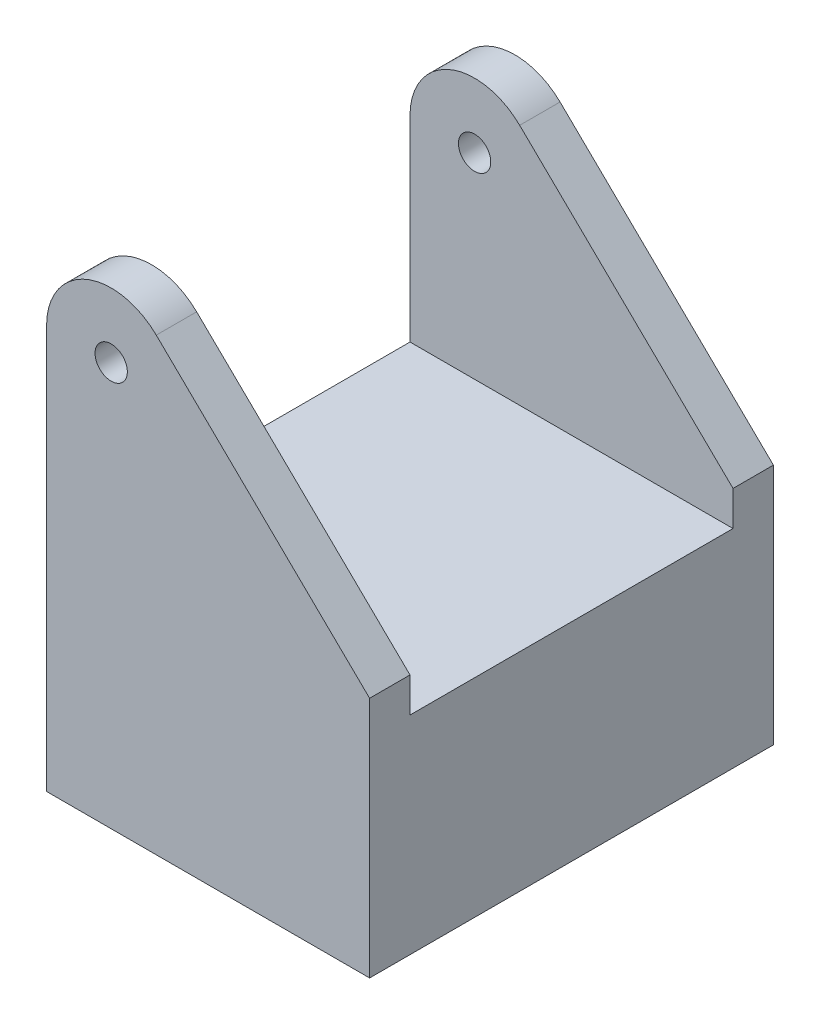
ISO-10303-21;
HEADER;
FILE_DESCRIPTION(('STEP AP214'),'2;1');
FILE_NAME('part.step','',(''),(''),'','','');
FILE_SCHEMA(('AUTOMOTIVE_DESIGN { 1 0 10303 214 1 1 1 1 }'));
ENDSEC;
DATA;
#1=APPLICATION_CONTEXT('core data for automotive mechanical design processes');
#2=APPLICATION_PROTOCOL_DEFINITION('international standard','automotive_design',2000,#1);
#3=PRODUCT_CONTEXT('',#1,'mechanical');
#4=PRODUCT('Part','Part','',(#3));
#5=PRODUCT_RELATED_PRODUCT_CATEGORY('part','',(#4));
#6=PRODUCT_DEFINITION_FORMATION('','',#4);
#7=PRODUCT_DEFINITION_CONTEXT('part definition',#1,'design');
#8=PRODUCT_DEFINITION('design','',#6,#7);
#9=PRODUCT_DEFINITION_SHAPE('','',#8);
#10=(LENGTH_UNIT() NAMED_UNIT(*) SI_UNIT(.MILLI.,.METRE.));
#11=(NAMED_UNIT(*) PLANE_ANGLE_UNIT() SI_UNIT($,.RADIAN.));
#12=(NAMED_UNIT(*) SI_UNIT($,.STERADIAN.) SOLID_ANGLE_UNIT());
#13=UNCERTAINTY_MEASURE_WITH_UNIT(LENGTH_MEASURE(1.E-05),#10,'distance_accuracy_value','');
#14=(GEOMETRIC_REPRESENTATION_CONTEXT(3) GLOBAL_UNCERTAINTY_ASSIGNED_CONTEXT((#13)) GLOBAL_UNIT_ASSIGNED_CONTEXT((#10,
#11,#12)) REPRESENTATION_CONTEXT('',''));
#15=CARTESIAN_POINT('',(0.,0.,0.));
#16=DIRECTION('',(0.,0.,1.));
#17=DIRECTION('',(1.,0.,0.));
#18=AXIS2_PLACEMENT_3D('',#15,#16,#17);
#19=CARTESIAN_POINT('',(200.,150.,250.));
#20=DIRECTION('',(-0.697727216701848,-0.716363546722956,0.));
#21=DIRECTION('',(0.716363546722956,-0.697727216701848,0.));
#22=AXIS2_PLACEMENT_3D('',#19,#20,#21);
#23=PLANE('',#22);
#24=DIRECTION('',(0.,0.,-1.));
#25=VECTOR('',#24,1.);
#26=CARTESIAN_POINT('',(67.9090886680739,278.654541868918,250.));
#27=LINE('',#26,#25);
#28=CARTESIAN_POINT('',(67.9090886680739,278.654541868918,25.));
#29=VERTEX_POINT('',#28);
#30=CARTESIAN_POINT('',(67.9090886680739,278.654541868918,0.));
#31=VERTEX_POINT('',#30);
#32=EDGE_CURVE('E143',#29,#31,#27,.T.);
#33=ORIENTED_EDGE('',*,*,#32,.F.);
#34=DIRECTION('',(0.716363546722956,-0.697727216701848,0.));
#35=VECTOR('',#34,1.);
#36=CARTESIAN_POINT('',(200.,150.,25.));
#37=LINE('',#36,#35);
#38=CARTESIAN_POINT('',(200.,150.,25.));
#39=VERTEX_POINT('',#38);
#40=EDGE_CURVE('E172',#29,#39,#37,.T.);
#41=ORIENTED_EDGE('',*,*,#40,.T.);
#42=DIRECTION('',(0.,0.,-1.));
#43=VECTOR('',#42,1.);
#44=CARTESIAN_POINT('',(200.,150.,250.));
#45=LINE('',#44,#43);
#46=CARTESIAN_POINT('',(200.,150.,0.));
#47=VERTEX_POINT('',#46);
#48=EDGE_CURVE('E117',#39,#47,#45,.T.);
#49=ORIENTED_EDGE('',*,*,#48,.T.);
#50=DIRECTION('',(-0.716363546722956,0.697727216701848,0.));
#51=VECTOR('',#50,1.);
#52=CARTESIAN_POINT('',(200.,150.,0.));
#53=LINE('',#52,#51);
#54=EDGE_CURVE('E134',#47,#31,#53,.T.);
#55=ORIENTED_EDGE('',*,*,#54,.T.);
#56=EDGE_LOOP('',(#33,#41,#49,#55));
#57=FACE_BOUND('',#56,.T.);
#58=ADVANCED_FACE('F32',(#57),#23,.F.);
#59=CARTESIAN_POINT('',(40.,250.,250.));
#60=DIRECTION('',(0.,0.,-1.));
#61=DIRECTION('',(-1.,0.,0.));
#62=AXIS2_PLACEMENT_3D('',#59,#60,#61);
#63=CYLINDRICAL_SURFACE('',#62,40.);
#64=CARTESIAN_POINT('',(40.,250.,25.));
#65=DIRECTION('',(0.,0.,-1.));
#66=DIRECTION('',(0.,1.,0.));
#67=AXIS2_PLACEMENT_3D('',#64,#65,#66);
#68=CIRCLE('',#67,40.);
#69=CARTESIAN_POINT('',(0.,250.,25.));
#70=VERTEX_POINT('',#69);
#71=EDGE_CURVE('E169',#70,#29,#68,.T.);
#72=ORIENTED_EDGE('',*,*,#71,.T.);
#73=ORIENTED_EDGE('',*,*,#32,.T.);
#74=CARTESIAN_POINT('',(40.,250.,0.));
#75=DIRECTION('',(0.,0.,1.));
#76=DIRECTION('',(1.,0.,0.));
#77=AXIS2_PLACEMENT_3D('',#74,#75,#76);
#78=CIRCLE('',#77,40.);
#79=CARTESIAN_POINT('',(0.,250.,0.));
#80=VERTEX_POINT('',#79);
#81=EDGE_CURVE('E137',#31,#80,#78,.T.);
#82=ORIENTED_EDGE('',*,*,#81,.T.);
#83=DIRECTION('',(0.,0.,-1.));
#84=VECTOR('',#83,1.);
#85=CARTESIAN_POINT('',(0.,250.,250.));
#86=LINE('',#85,#84);
#87=EDGE_CURVE('E81',#70,#80,#86,.T.);
#88=ORIENTED_EDGE('',*,*,#87,.F.);
#89=EDGE_LOOP('',(#72,#73,#82,#88));
#90=FACE_BOUND('',#89,.T.);
#91=ADVANCED_FACE('F225',(#90),#63,.T.);
#92=CARTESIAN_POINT('',(40.,250.,250.));
#93=DIRECTION('',(0.,0.,-1.));
#94=DIRECTION('',(-1.,0.,0.));
#95=AXIS2_PLACEMENT_3D('',#92,#93,#94);
#96=CYLINDRICAL_SURFACE('',#95,10.);
#97=CARTESIAN_POINT('',(40.,250.,25.));
#98=DIRECTION('',(0.,0.,-1.));
#99=DIRECTION('',(0.,1.,0.));
#100=AXIS2_PLACEMENT_3D('',#97,#98,#99);
#101=CIRCLE('',#100,10.);
#102=CARTESIAN_POINT('',(40.,260.,25.));
#103=VERTEX_POINT('',#102);
#104=EDGE_CURVE('E36',#103,#103,#101,.T.);
#105=ORIENTED_EDGE('',*,*,#104,.F.);
#106=EDGE_LOOP('',(#105));
#107=FACE_BOUND('',#106,.T.);
#108=CARTESIAN_POINT('',(40.,250.,0.));
#109=DIRECTION('',(0.,0.,1.));
#110=DIRECTION('',(1.,0.,0.));
#111=AXIS2_PLACEMENT_3D('',#108,#109,#110);
#112=CIRCLE('',#111,10.);
#113=CARTESIAN_POINT('',(50.,250.,0.));
#114=VERTEX_POINT('',#113);
#115=EDGE_CURVE('E180',#114,#114,#112,.T.);
#116=ORIENTED_EDGE('',*,*,#115,.F.);
#117=EDGE_LOOP('',(#116));
#118=FACE_BOUND('',#117,.T.);
#119=ADVANCED_FACE('F227',(#107,#118),#96,.F.);
#120=CARTESIAN_POINT('',(40.,250.,250.));
#121=DIRECTION('',(0.,0.,1.));
#122=DIRECTION('',(1.,0.,0.));
#123=AXIS2_PLACEMENT_3D('',#120,#121,#122);
#124=PLANE('',#123);
#125=DIRECTION('',(0.,-1.,0.));
#126=VECTOR('',#125,1.);
#127=CARTESIAN_POINT('',(0.,0.,250.));
#128=LINE('',#127,#126);
#129=CARTESIAN_POINT('',(0.,250.,250.));
#130=VERTEX_POINT('',#129);
#131=CARTESIAN_POINT('',(0.,0.,250.));
#132=VERTEX_POINT('',#131);
#133=EDGE_CURVE('E58',#130,#132,#128,.T.);
#134=ORIENTED_EDGE('',*,*,#133,.T.);
#135=DIRECTION('',(1.,0.,0.));
#136=VECTOR('',#135,1.);
#137=CARTESIAN_POINT('',(0.,0.,250.));
#138=LINE('',#137,#136);
#139=CARTESIAN_POINT('',(200.,0.,250.));
#140=VERTEX_POINT('',#139);
#141=EDGE_CURVE('E89',#132,#140,#138,.T.);
#142=ORIENTED_EDGE('',*,*,#141,.T.);
#143=DIRECTION('',(0.,1.,0.));
#144=VECTOR('',#143,1.);
#145=CARTESIAN_POINT('',(200.,0.,250.));
#146=LINE('',#145,#144);
#147=CARTESIAN_POINT('',(200.,150.,250.));
#148=VERTEX_POINT('',#147);
#149=EDGE_CURVE('E96',#140,#148,#146,.T.);
#150=ORIENTED_EDGE('',*,*,#149,.T.);
#151=DIRECTION('',(-0.716363546722956,0.697727216701848,0.));
#152=VECTOR('',#151,1.);
#153=CARTESIAN_POINT('',(200.,150.,250.));
#154=LINE('',#153,#152);
#155=CARTESIAN_POINT('',(67.9090886680739,278.654541868918,250.));
#156=VERTEX_POINT('',#155);
#157=EDGE_CURVE('E101',#148,#156,#154,.T.);
#158=ORIENTED_EDGE('',*,*,#157,.T.);
#159=CARTESIAN_POINT('',(40.,250.,250.));
#160=DIRECTION('',(0.,0.,1.));
#161=DIRECTION('',(1.,0.,0.));
#162=AXIS2_PLACEMENT_3D('',#159,#160,#161);
#163=CIRCLE('',#162,40.);
#164=EDGE_CURVE('E123',#156,#130,#163,.T.);
#165=ORIENTED_EDGE('',*,*,#164,.T.);
#166=EDGE_LOOP('',(#134,#142,#150,#158,#165));
#167=FACE_BOUND('',#166,.T.);
#168=CARTESIAN_POINT('',(40.,250.,250.));
#169=DIRECTION('',(0.,0.,1.));
#170=DIRECTION('',(1.,0.,0.));
#171=AXIS2_PLACEMENT_3D('',#168,#169,#170);
#172=CIRCLE('',#171,10.);
#173=CARTESIAN_POINT('',(50.,250.,250.));
#174=VERTEX_POINT('',#173);
#175=EDGE_CURVE('E131',#174,#174,#172,.T.);
#176=ORIENTED_EDGE('',*,*,#175,.F.);
#177=EDGE_LOOP('',(#176));
#178=FACE_BOUND('',#177,.T.);
#179=ADVANCED_FACE('F98',(#167,#178),#124,.T.);
#180=CARTESIAN_POINT('',(40.,250.,0.));
#181=DIRECTION('',(0.,0.,1.));
#182=DIRECTION('',(1.,0.,0.));
#183=AXIS2_PLACEMENT_3D('',#180,#181,#182);
#184=PLANE('',#183);
#185=DIRECTION('',(1.,0.,0.));
#186=VECTOR('',#185,1.);
#187=CARTESIAN_POINT('',(0.,0.,0.));
#188=LINE('',#187,#186);
#189=CARTESIAN_POINT('',(0.,0.,0.));
#190=VERTEX_POINT('',#189);
#191=CARTESIAN_POINT('',(200.,0.,0.));
#192=VERTEX_POINT('',#191);
#193=EDGE_CURVE('E128',#190,#192,#188,.T.);
#194=ORIENTED_EDGE('',*,*,#193,.F.);
#195=DIRECTION('',(0.,-1.,0.));
#196=VECTOR('',#195,1.);
#197=CARTESIAN_POINT('',(0.,150.,0.));
#198=LINE('',#197,#196);
#199=EDGE_CURVE('E139',#80,#190,#198,.T.);
#200=ORIENTED_EDGE('',*,*,#199,.F.);
#201=ORIENTED_EDGE('',*,*,#81,.F.);
#202=ORIENTED_EDGE('',*,*,#54,.F.);
#203=DIRECTION('',(0.,1.,0.));
#204=VECTOR('',#203,1.);
#205=CARTESIAN_POINT('',(200.,0.,0.));
#206=LINE('',#205,#204);
#207=EDGE_CURVE('E130',#192,#47,#206,.T.);
#208=ORIENTED_EDGE('',*,*,#207,.F.);
#209=EDGE_LOOP('',(#194,#200,#201,#202,#208));
#210=FACE_BOUND('',#209,.T.);
#211=ORIENTED_EDGE('',*,*,#115,.T.);
#212=EDGE_LOOP('',(#211));
#213=FACE_BOUND('',#212,.T.);
#214=ADVANCED_FACE('F193',(#210,#213),#184,.F.);
#215=CARTESIAN_POINT('',(0.,0.,250.));
#216=DIRECTION('',(0.,1.,0.));
#217=DIRECTION('',(0.,0.,1.));
#218=AXIS2_PLACEMENT_3D('',#215,#216,#217);
#219=PLANE('',#218);
#220=ORIENTED_EDGE('',*,*,#193,.T.);
#221=DIRECTION('',(0.,0.,-1.));
#222=VECTOR('',#221,1.);
#223=CARTESIAN_POINT('',(200.,0.,250.));
#224=LINE('',#223,#222);
#225=EDGE_CURVE('E41',#140,#192,#224,.T.);
#226=ORIENTED_EDGE('',*,*,#225,.F.);
#227=ORIENTED_EDGE('',*,*,#141,.F.);
#228=DIRECTION('',(0.,0.,-1.));
#229=VECTOR('',#228,1.);
#230=CARTESIAN_POINT('',(0.,0.,250.));
#231=LINE('',#230,#229);
#232=EDGE_CURVE('E11',#132,#190,#231,.T.);
#233=ORIENTED_EDGE('',*,*,#232,.T.);
#234=EDGE_LOOP('',(#220,#226,#227,#233));
#235=FACE_BOUND('',#234,.T.);
#236=ADVANCED_FACE('F34',(#235),#219,.F.);
#237=CARTESIAN_POINT('',(200.,0.,250.));
#238=DIRECTION('',(-1.,0.,0.));
#239=DIRECTION('',(0.,0.,1.));
#240=AXIS2_PLACEMENT_3D('',#237,#238,#239);
#241=PLANE('',#240);
#242=ORIENTED_EDGE('',*,*,#48,.F.);
#243=DIRECTION('',(0.,-1.,0.));
#244=VECTOR('',#243,1.);
#245=CARTESIAN_POINT('',(200.,0.,25.));
#246=LINE('',#245,#244);
#247=CARTESIAN_POINT('',(200.,128.5,25.));
#248=VERTEX_POINT('',#247);
#249=EDGE_CURVE('E175',#39,#248,#246,.T.);
#250=ORIENTED_EDGE('',*,*,#249,.T.);
#251=DIRECTION('',(0.,0.,1.));
#252=VECTOR('',#251,1.);
#253=CARTESIAN_POINT('',(200.,128.5,250.));
#254=LINE('',#253,#252);
#255=CARTESIAN_POINT('',(200.,128.5,225.));
#256=VERTEX_POINT('',#255);
#257=EDGE_CURVE('E178',#248,#256,#254,.T.);
#258=ORIENTED_EDGE('',*,*,#257,.T.);
#259=DIRECTION('',(0.,1.,0.));
#260=VECTOR('',#259,1.);
#261=CARTESIAN_POINT('',(200.,0.,225.));
#262=LINE('',#261,#260);
#263=CARTESIAN_POINT('',(200.,150.,225.));
#264=VERTEX_POINT('',#263);
#265=EDGE_CURVE('E114',#256,#264,#262,.T.);
#266=ORIENTED_EDGE('',*,*,#265,.T.);
#267=EDGE_CURVE('E108',#148,#264,#45,.T.);
#268=ORIENTED_EDGE('',*,*,#267,.F.);
#269=ORIENTED_EDGE('',*,*,#149,.F.);
#270=ORIENTED_EDGE('',*,*,#225,.T.);
#271=ORIENTED_EDGE('',*,*,#207,.T.);
#272=EDGE_LOOP('',(#242,#250,#258,#266,#268,#269,#270,#271));
#273=FACE_BOUND('',#272,.T.);
#274=ADVANCED_FACE('F110',(#273),#241,.F.);
#275=ORIENTED_EDGE('',*,*,#267,.T.);
#276=DIRECTION('',(-0.716363546722956,0.697727216701848,0.));
#277=VECTOR('',#276,1.);
#278=CARTESIAN_POINT('',(200.,150.,225.));
#279=LINE('',#278,#277);
#280=CARTESIAN_POINT('',(67.9090886680739,278.654541868918,225.));
#281=VERTEX_POINT('',#280);
#282=EDGE_CURVE('E152',#264,#281,#279,.T.);
#283=ORIENTED_EDGE('',*,*,#282,.T.);
#284=EDGE_CURVE('E121',#156,#281,#27,.T.);
#285=ORIENTED_EDGE('',*,*,#284,.F.);
#286=ORIENTED_EDGE('',*,*,#157,.F.);
#287=EDGE_LOOP('',(#275,#283,#285,#286));
#288=FACE_BOUND('',#287,.T.);
#289=ADVANCED_FACE('F119',(#288),#23,.F.);
#290=CARTESIAN_POINT('',(40.,250.,225.));
#291=DIRECTION('',(0.,0.,1.));
#292=DIRECTION('',(0.,-1.,0.));
#293=AXIS2_PLACEMENT_3D('',#290,#291,#292);
#294=CIRCLE('',#293,40.);
#295=CARTESIAN_POINT('',(0.,250.,225.));
#296=VERTEX_POINT('',#295);
#297=EDGE_CURVE('E147',#281,#296,#294,.T.);
#298=ORIENTED_EDGE('',*,*,#297,.T.);
#299=EDGE_CURVE('E141',#130,#296,#86,.T.);
#300=ORIENTED_EDGE('',*,*,#299,.F.);
#301=ORIENTED_EDGE('',*,*,#164,.F.);
#302=ORIENTED_EDGE('',*,*,#284,.T.);
#303=EDGE_LOOP('',(#298,#300,#301,#302));
#304=FACE_BOUND('',#303,.T.);
#305=ADVANCED_FACE('F218',(#304),#63,.T.);
#306=CARTESIAN_POINT('',(0.,150.,250.));
#307=DIRECTION('',(1.,0.,0.));
#308=DIRECTION('',(0.,1.,0.));
#309=AXIS2_PLACEMENT_3D('',#306,#307,#308);
#310=PLANE('',#309);
#311=DIRECTION('',(0.,0.,1.));
#312=VECTOR('',#311,1.);
#313=CARTESIAN_POINT('',(0.,128.5,25.));
#314=LINE('',#313,#312);
#315=CARTESIAN_POINT('',(0.,128.5,25.));
#316=VERTEX_POINT('',#315);
#317=CARTESIAN_POINT('',(0.,128.5,225.));
#318=VERTEX_POINT('',#317);
#319=EDGE_CURVE('E221',#316,#318,#314,.T.);
#320=ORIENTED_EDGE('',*,*,#319,.F.);
#321=DIRECTION('',(0.,-1.,0.));
#322=VECTOR('',#321,1.);
#323=CARTESIAN_POINT('',(-1.00613961606655E-13,290.,25.));
#324=LINE('',#323,#322);
#325=EDGE_CURVE('E49',#70,#316,#324,.T.);
#326=ORIENTED_EDGE('',*,*,#325,.F.);
#327=ORIENTED_EDGE('',*,*,#87,.T.);
#328=ORIENTED_EDGE('',*,*,#199,.T.);
#329=ORIENTED_EDGE('',*,*,#232,.F.);
#330=ORIENTED_EDGE('',*,*,#133,.F.);
#331=ORIENTED_EDGE('',*,*,#299,.T.);
#332=DIRECTION('',(0.,1.,0.));
#333=VECTOR('',#332,1.);
#334=CARTESIAN_POINT('',(-1.00613961606655E-13,290.,225.));
#335=LINE('',#334,#333);
#336=EDGE_CURVE('E162',#318,#296,#335,.T.);
#337=ORIENTED_EDGE('',*,*,#336,.F.);
#338=EDGE_LOOP('',(#320,#326,#327,#328,#329,#330,#331,#337));
#339=FACE_BOUND('',#338,.T.);
#340=ADVANCED_FACE('F187',(#339),#310,.F.);
#341=CARTESIAN_POINT('',(40.,250.,225.));
#342=DIRECTION('',(0.,0.,1.));
#343=DIRECTION('',(0.,-1.,0.));
#344=AXIS2_PLACEMENT_3D('',#341,#342,#343);
#345=CIRCLE('',#344,10.);
#346=CARTESIAN_POINT('',(40.,240.,225.));
#347=VERTEX_POINT('',#346);
#348=EDGE_CURVE('E145',#347,#347,#345,.T.);
#349=ORIENTED_EDGE('',*,*,#348,.F.);
#350=EDGE_LOOP('',(#349));
#351=FACE_BOUND('',#350,.T.);
#352=ORIENTED_EDGE('',*,*,#175,.T.);
#353=EDGE_LOOP('',(#352));
#354=FACE_BOUND('',#353,.T.);
#355=ADVANCED_FACE('F235',(#351,#354),#96,.F.);
#356=CARTESIAN_POINT('',(250.,128.5,25.));
#357=DIRECTION('',(0.,-1.,0.));
#358=DIRECTION('',(1.,0.,0.));
#359=AXIS2_PLACEMENT_3D('',#356,#357,#358);
#360=PLANE('',#359);
#361=DIRECTION('',(-1.,0.,0.));
#362=VECTOR('',#361,1.);
#363=CARTESIAN_POINT('',(250.,128.5,25.));
#364=LINE('',#363,#362);
#365=EDGE_CURVE('E155',#248,#316,#364,.T.);
#366=ORIENTED_EDGE('',*,*,#365,.T.);
#367=ORIENTED_EDGE('',*,*,#319,.T.);
#368=DIRECTION('',(-1.,0.,0.));
#369=VECTOR('',#368,1.);
#370=CARTESIAN_POINT('',(250.,128.5,225.));
#371=LINE('',#370,#369);
#372=EDGE_CURVE('E148',#256,#318,#371,.T.);
#373=ORIENTED_EDGE('',*,*,#372,.F.);
#374=ORIENTED_EDGE('',*,*,#257,.F.);
#375=EDGE_LOOP('',(#366,#367,#373,#374));
#376=FACE_BOUND('',#375,.T.);
#377=ADVANCED_FACE('F224',(#376),#360,.F.);
#378=CARTESIAN_POINT('',(250.,290.,25.));
#379=DIRECTION('',(0.,0.,-1.));
#380=DIRECTION('',(0.,1.,0.));
#381=AXIS2_PLACEMENT_3D('',#378,#379,#380);
#382=PLANE('',#381);
#383=ORIENTED_EDGE('',*,*,#104,.T.);
#384=EDGE_LOOP('',(#383));
#385=FACE_BOUND('',#384,.T.);
#386=ORIENTED_EDGE('',*,*,#40,.F.);
#387=ORIENTED_EDGE('',*,*,#71,.F.);
#388=ORIENTED_EDGE('',*,*,#325,.T.);
#389=ORIENTED_EDGE('',*,*,#365,.F.);
#390=ORIENTED_EDGE('',*,*,#249,.F.);
#391=EDGE_LOOP('',(#386,#387,#388,#389,#390));
#392=FACE_BOUND('',#391,.T.);
#393=ADVANCED_FACE('F260',(#385,#392),#382,.F.);
#394=CARTESIAN_POINT('',(250.,290.,225.));
#395=DIRECTION('',(0.,0.,1.));
#396=DIRECTION('',(0.,-1.,0.));
#397=AXIS2_PLACEMENT_3D('',#394,#395,#396);
#398=PLANE('',#397);
#399=ORIENTED_EDGE('',*,*,#348,.T.);
#400=EDGE_LOOP('',(#399));
#401=FACE_BOUND('',#400,.T.);
#402=ORIENTED_EDGE('',*,*,#372,.T.);
#403=ORIENTED_EDGE('',*,*,#336,.T.);
#404=ORIENTED_EDGE('',*,*,#297,.F.);
#405=ORIENTED_EDGE('',*,*,#282,.F.);
#406=ORIENTED_EDGE('',*,*,#265,.F.);
#407=EDGE_LOOP('',(#402,#403,#404,#405,#406));
#408=FACE_BOUND('',#407,.T.);
#409=ADVANCED_FACE('F220',(#401,#408),#398,.F.);
#410=CLOSED_SHELL('',(#58,#91,#119,#179,#214,#236,#274,#289,#305,#340,#355,#377,#393,#409));
#411=MANIFOLD_SOLID_BREP('B2',#410);
#412=ADVANCED_BREP_SHAPE_REPRESENTATION('',(#18,#411),#14);
#413=SHAPE_DEFINITION_REPRESENTATION(#9,#412);
ENDSEC;
END-ISO-10303-21;
